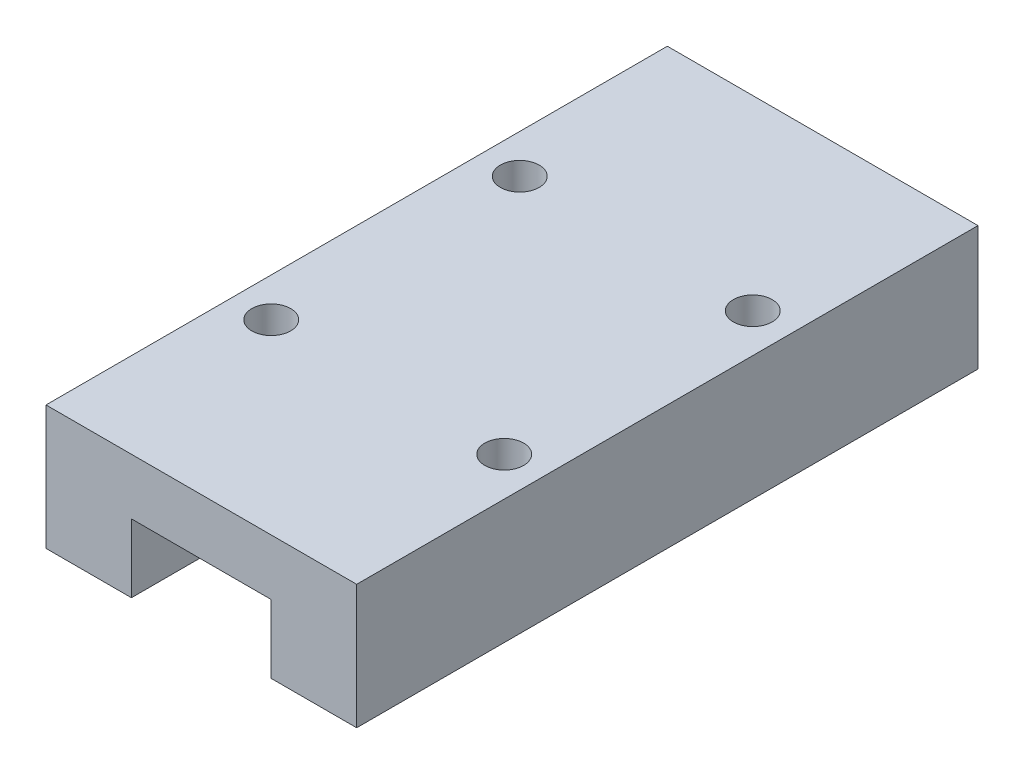
ISO-10303-21;
HEADER;
FILE_DESCRIPTION(('STEP AP214'),'2;1');
FILE_NAME('part.step','',(''),(''),'','','');
FILE_SCHEMA(('AUTOMOTIVE_DESIGN { 1 0 10303 214 1 1 1 1 }'));
ENDSEC;
DATA;
#1=APPLICATION_CONTEXT('core data for automotive mechanical design processes');
#2=APPLICATION_PROTOCOL_DEFINITION('international standard','automotive_design',2000,#1);
#3=PRODUCT_CONTEXT('',#1,'mechanical');
#4=PRODUCT('Part','Part','',(#3));
#5=PRODUCT_RELATED_PRODUCT_CATEGORY('part','',(#4));
#6=PRODUCT_DEFINITION_FORMATION('','',#4);
#7=PRODUCT_DEFINITION_CONTEXT('part definition',#1,'design');
#8=PRODUCT_DEFINITION('design','',#6,#7);
#9=PRODUCT_DEFINITION_SHAPE('','',#8);
#10=(LENGTH_UNIT() NAMED_UNIT(*) SI_UNIT(.MILLI.,.METRE.));
#11=(NAMED_UNIT(*) PLANE_ANGLE_UNIT() SI_UNIT($,.RADIAN.));
#12=(NAMED_UNIT(*) SI_UNIT($,.STERADIAN.) SOLID_ANGLE_UNIT());
#13=UNCERTAINTY_MEASURE_WITH_UNIT(LENGTH_MEASURE(1.E-05),#10,'distance_accuracy_value','');
#14=(GEOMETRIC_REPRESENTATION_CONTEXT(3) GLOBAL_UNCERTAINTY_ASSIGNED_CONTEXT((#13)) GLOBAL_UNIT_ASSIGNED_CONTEXT((#10,
#11,#12)) REPRESENTATION_CONTEXT('',''));
#15=CARTESIAN_POINT('',(0.,0.,0.));
#16=DIRECTION('',(0.,0.,1.));
#17=DIRECTION('',(1.,0.,0.));
#18=AXIS2_PLACEMENT_3D('',#15,#16,#17);
#19=CARTESIAN_POINT('',(0.,0.,40.));
#20=DIRECTION('',(1.,0.,0.));
#21=DIRECTION('',(0.,0.,-1.));
#22=AXIS2_PLACEMENT_3D('',#19,#20,#21);
#23=PLANE('',#22);
#24=DIRECTION('',(0.,-1.,0.));
#25=VECTOR('',#24,1.);
#26=CARTESIAN_POINT('',(0.,0.,0.));
#27=LINE('',#26,#25);
#28=CARTESIAN_POINT('',(0.,8.,0.));
#29=VERTEX_POINT('',#28);
#30=CARTESIAN_POINT('',(0.,0.,0.));
#31=VERTEX_POINT('',#30);
#32=EDGE_CURVE('E129',#29,#31,#27,.T.);
#33=ORIENTED_EDGE('',*,*,#32,.T.);
#34=DIRECTION('',(0.,0.,-1.));
#35=VECTOR('',#34,1.);
#36=CARTESIAN_POINT('',(0.,0.,40.));
#37=LINE('',#36,#35);
#38=CARTESIAN_POINT('',(0.,0.,40.));
#39=VERTEX_POINT('',#38);
#40=EDGE_CURVE('E11',#39,#31,#37,.T.);
#41=ORIENTED_EDGE('',*,*,#40,.F.);
#42=DIRECTION('',(0.,-1.,0.));
#43=VECTOR('',#42,1.);
#44=CARTESIAN_POINT('',(0.,0.,40.));
#45=LINE('',#44,#43);
#46=CARTESIAN_POINT('',(0.,8.,40.));
#47=VERTEX_POINT('',#46);
#48=EDGE_CURVE('E144',#47,#39,#45,.T.);
#49=ORIENTED_EDGE('',*,*,#48,.F.);
#50=DIRECTION('',(0.,0.,-1.));
#51=VECTOR('',#50,1.);
#52=CARTESIAN_POINT('',(0.,8.,40.));
#53=LINE('',#52,#51);
#54=EDGE_CURVE('E125',#47,#29,#53,.T.);
#55=ORIENTED_EDGE('',*,*,#54,.T.);
#56=EDGE_LOOP('',(#33,#41,#49,#55));
#57=FACE_BOUND('',#56,.T.);
#58=ADVANCED_FACE('F33',(#57),#23,.F.);
#59=CARTESIAN_POINT('',(0.,0.,40.));
#60=DIRECTION('',(0.,1.,0.));
#61=DIRECTION('',(0.,0.,1.));
#62=AXIS2_PLACEMENT_3D('',#59,#60,#61);
#63=PLANE('',#62);
#64=DIRECTION('',(1.,0.,0.));
#65=VECTOR('',#64,1.);
#66=CARTESIAN_POINT('',(0.,0.,0.));
#67=LINE('',#66,#65);
#68=CARTESIAN_POINT('',(5.5,0.,0.));
#69=VERTEX_POINT('',#68);
#70=EDGE_CURVE('E132',#31,#69,#67,.T.);
#71=ORIENTED_EDGE('',*,*,#70,.T.);
#72=DIRECTION('',(0.,0.,-1.));
#73=VECTOR('',#72,1.);
#74=CARTESIAN_POINT('',(5.5,0.,40.));
#75=LINE('',#74,#73);
#76=CARTESIAN_POINT('',(5.5,0.,40.));
#77=VERTEX_POINT('',#76);
#78=EDGE_CURVE('E41',#77,#69,#75,.T.);
#79=ORIENTED_EDGE('',*,*,#78,.F.);
#80=DIRECTION('',(1.,0.,0.));
#81=VECTOR('',#80,1.);
#82=CARTESIAN_POINT('',(0.,0.,40.));
#83=LINE('',#82,#81);
#84=EDGE_CURVE('E92',#39,#77,#83,.T.);
#85=ORIENTED_EDGE('',*,*,#84,.F.);
#86=ORIENTED_EDGE('',*,*,#40,.T.);
#87=EDGE_LOOP('',(#71,#79,#85,#86));
#88=FACE_BOUND('',#87,.T.);
#89=ADVANCED_FACE('F231',(#88),#63,.F.);
#90=CARTESIAN_POINT('',(5.5,0.,40.));
#91=DIRECTION('',(-1.,0.,0.));
#92=DIRECTION('',(0.,0.,1.));
#93=AXIS2_PLACEMENT_3D('',#90,#91,#92);
#94=PLANE('',#93);
#95=DIRECTION('',(0.,1.,0.));
#96=VECTOR('',#95,1.);
#97=CARTESIAN_POINT('',(5.5,0.,0.));
#98=LINE('',#97,#96);
#99=CARTESIAN_POINT('',(5.5,4.4,0.));
#100=VERTEX_POINT('',#99);
#101=EDGE_CURVE('E135',#69,#100,#98,.T.);
#102=ORIENTED_EDGE('',*,*,#101,.T.);
#103=DIRECTION('',(0.,0.,-1.));
#104=VECTOR('',#103,1.);
#105=CARTESIAN_POINT('',(5.5,4.4,40.));
#106=LINE('',#105,#104);
#107=CARTESIAN_POINT('',(5.5,4.4,40.));
#108=VERTEX_POINT('',#107);
#109=EDGE_CURVE('E151',#108,#100,#106,.T.);
#110=ORIENTED_EDGE('',*,*,#109,.F.);
#111=DIRECTION('',(0.,1.,0.));
#112=VECTOR('',#111,1.);
#113=CARTESIAN_POINT('',(5.5,0.,40.));
#114=LINE('',#113,#112);
#115=EDGE_CURVE('E159',#77,#108,#114,.T.);
#116=ORIENTED_EDGE('',*,*,#115,.F.);
#117=ORIENTED_EDGE('',*,*,#78,.T.);
#118=EDGE_LOOP('',(#102,#110,#116,#117));
#119=FACE_BOUND('',#118,.T.);
#120=ADVANCED_FACE('F157',(#119),#94,.F.);
#121=CARTESIAN_POINT('',(5.5,4.4,40.));
#122=DIRECTION('',(0.,1.,0.));
#123=DIRECTION('',(0.,0.,1.));
#124=AXIS2_PLACEMENT_3D('',#121,#122,#123);
#125=PLANE('',#124);
#126=DIRECTION('',(1.,0.,0.));
#127=VECTOR('',#126,1.);
#128=CARTESIAN_POINT('',(5.5,4.4,0.));
#129=LINE('',#128,#127);
#130=CARTESIAN_POINT('',(14.5,4.4,0.));
#131=VERTEX_POINT('',#130);
#132=EDGE_CURVE('E137',#100,#131,#129,.T.);
#133=ORIENTED_EDGE('',*,*,#132,.T.);
#134=DIRECTION('',(0.,0.,-1.));
#135=VECTOR('',#134,1.);
#136=CARTESIAN_POINT('',(14.5,4.4,40.));
#137=LINE('',#136,#135);
#138=CARTESIAN_POINT('',(14.5,4.4,40.));
#139=VERTEX_POINT('',#138);
#140=EDGE_CURVE('E148',#139,#131,#137,.T.);
#141=ORIENTED_EDGE('',*,*,#140,.F.);
#142=DIRECTION('',(1.,0.,0.));
#143=VECTOR('',#142,1.);
#144=CARTESIAN_POINT('',(5.5,4.4,40.));
#145=LINE('',#144,#143);
#146=EDGE_CURVE('E171',#108,#139,#145,.T.);
#147=ORIENTED_EDGE('',*,*,#146,.F.);
#148=ORIENTED_EDGE('',*,*,#109,.T.);
#149=EDGE_LOOP('',(#133,#141,#147,#148));
#150=FACE_BOUND('',#149,.T.);
#151=ADVANCED_FACE('F167',(#150),#125,.F.);
#152=CARTESIAN_POINT('',(14.5,4.4,40.));
#153=DIRECTION('',(1.,0.,0.));
#154=DIRECTION('',(0.,0.,-1.));
#155=AXIS2_PLACEMENT_3D('',#152,#153,#154);
#156=PLANE('',#155);
#157=DIRECTION('',(0.,-1.,0.));
#158=VECTOR('',#157,1.);
#159=CARTESIAN_POINT('',(14.5,4.4,0.));
#160=LINE('',#159,#158);
#161=CARTESIAN_POINT('',(14.5,0.,0.));
#162=VERTEX_POINT('',#161);
#163=EDGE_CURVE('E139',#131,#162,#160,.T.);
#164=ORIENTED_EDGE('',*,*,#163,.T.);
#165=DIRECTION('',(0.,0.,-1.));
#166=VECTOR('',#165,1.);
#167=CARTESIAN_POINT('',(14.5,0.,40.));
#168=LINE('',#167,#166);
#169=CARTESIAN_POINT('',(14.5,0.,40.));
#170=VERTEX_POINT('',#169);
#171=EDGE_CURVE('E120',#170,#162,#168,.T.);
#172=ORIENTED_EDGE('',*,*,#171,.F.);
#173=DIRECTION('',(0.,-1.,0.));
#174=VECTOR('',#173,1.);
#175=CARTESIAN_POINT('',(14.5,4.4,40.));
#176=LINE('',#175,#174);
#177=EDGE_CURVE('E111',#139,#170,#176,.T.);
#178=ORIENTED_EDGE('',*,*,#177,.F.);
#179=ORIENTED_EDGE('',*,*,#140,.T.);
#180=EDGE_LOOP('',(#164,#172,#178,#179));
#181=FACE_BOUND('',#180,.T.);
#182=ADVANCED_FACE('F170',(#181),#156,.F.);
#183=CARTESIAN_POINT('',(14.5,0.,40.));
#184=DIRECTION('',(0.,1.,0.));
#185=DIRECTION('',(0.,0.,1.));
#186=AXIS2_PLACEMENT_3D('',#183,#184,#185);
#187=PLANE('',#186);
#188=DIRECTION('',(1.,0.,0.));
#189=VECTOR('',#188,1.);
#190=CARTESIAN_POINT('',(14.5,0.,0.));
#191=LINE('',#190,#189);
#192=CARTESIAN_POINT('',(20.,0.,0.));
#193=VERTEX_POINT('',#192);
#194=EDGE_CURVE('E119',#162,#193,#191,.T.);
#195=ORIENTED_EDGE('',*,*,#194,.T.);
#196=DIRECTION('',(0.,0.,-1.));
#197=VECTOR('',#196,1.);
#198=CARTESIAN_POINT('',(20.,0.,40.));
#199=LINE('',#198,#197);
#200=CARTESIAN_POINT('',(20.,0.,40.));
#201=VERTEX_POINT('',#200);
#202=EDGE_CURVE('E116',#201,#193,#199,.T.);
#203=ORIENTED_EDGE('',*,*,#202,.F.);
#204=DIRECTION('',(1.,0.,0.));
#205=VECTOR('',#204,1.);
#206=CARTESIAN_POINT('',(14.5,0.,40.));
#207=LINE('',#206,#205);
#208=EDGE_CURVE('E105',#170,#201,#207,.T.);
#209=ORIENTED_EDGE('',*,*,#208,.F.);
#210=ORIENTED_EDGE('',*,*,#171,.T.);
#211=EDGE_LOOP('',(#195,#203,#209,#210));
#212=FACE_BOUND('',#211,.T.);
#213=ADVANCED_FACE('F117',(#212),#187,.F.);
#214=CARTESIAN_POINT('',(20.,0.,40.));
#215=DIRECTION('',(-1.,0.,0.));
#216=DIRECTION('',(0.,0.,1.));
#217=AXIS2_PLACEMENT_3D('',#214,#215,#216);
#218=PLANE('',#217);
#219=DIRECTION('',(0.,1.,0.));
#220=VECTOR('',#219,1.);
#221=CARTESIAN_POINT('',(20.,0.,0.));
#222=LINE('',#221,#220);
#223=CARTESIAN_POINT('',(20.,8.,0.));
#224=VERTEX_POINT('',#223);
#225=EDGE_CURVE('E78',#193,#224,#222,.T.);
#226=ORIENTED_EDGE('',*,*,#225,.T.);
#227=DIRECTION('',(0.,0.,-1.));
#228=VECTOR('',#227,1.);
#229=CARTESIAN_POINT('',(20.,8.,40.));
#230=LINE('',#229,#228);
#231=CARTESIAN_POINT('',(20.,8.,40.));
#232=VERTEX_POINT('',#231);
#233=EDGE_CURVE('E121',#232,#224,#230,.T.);
#234=ORIENTED_EDGE('',*,*,#233,.F.);
#235=DIRECTION('',(0.,1.,0.));
#236=VECTOR('',#235,1.);
#237=CARTESIAN_POINT('',(20.,0.,40.));
#238=LINE('',#237,#236);
#239=EDGE_CURVE('E109',#201,#232,#238,.T.);
#240=ORIENTED_EDGE('',*,*,#239,.F.);
#241=ORIENTED_EDGE('',*,*,#202,.T.);
#242=EDGE_LOOP('',(#226,#234,#240,#241));
#243=FACE_BOUND('',#242,.T.);
#244=ADVANCED_FACE('F123',(#243),#218,.F.);
#245=CARTESIAN_POINT('',(0.,8.,40.));
#246=DIRECTION('',(0.,-1.,0.));
#247=DIRECTION('',(0.,0.,-1.));
#248=AXIS2_PLACEMENT_3D('',#245,#246,#247);
#249=PLANE('',#248);
#250=CARTESIAN_POINT('',(2.5,8.,28.));
#251=DIRECTION('',(0.,1.,0.));
#252=DIRECTION('',(0.,0.,-1.));
#253=AXIS2_PLACEMENT_3D('',#250,#251,#252);
#254=CIRCLE('',#253,1.25);
#255=CARTESIAN_POINT('',(2.5,8.,26.75));
#256=VERTEX_POINT('',#255);
#257=EDGE_CURVE('E183',#256,#256,#254,.T.);
#258=ORIENTED_EDGE('',*,*,#257,.F.);
#259=EDGE_LOOP('',(#258));
#260=FACE_BOUND('',#259,.T.);
#261=CARTESIAN_POINT('',(17.5,8.,28.));
#262=DIRECTION('',(0.,1.,0.));
#263=DIRECTION('',(0.,0.,1.));
#264=AXIS2_PLACEMENT_3D('',#261,#262,#263);
#265=CIRCLE('',#264,1.25);
#266=CARTESIAN_POINT('',(17.5,8.,29.25));
#267=VERTEX_POINT('',#266);
#268=EDGE_CURVE('E189',#267,#267,#265,.T.);
#269=ORIENTED_EDGE('',*,*,#268,.F.);
#270=EDGE_LOOP('',(#269));
#271=FACE_BOUND('',#270,.T.);
#272=CARTESIAN_POINT('',(17.5,8.,12.));
#273=DIRECTION('',(0.,1.,0.));
#274=DIRECTION('',(0.,0.,-1.));
#275=AXIS2_PLACEMENT_3D('',#272,#273,#274);
#276=CIRCLE('',#275,1.25);
#277=CARTESIAN_POINT('',(17.5,8.,10.75));
#278=VERTEX_POINT('',#277);
#279=EDGE_CURVE('E195',#278,#278,#276,.T.);
#280=ORIENTED_EDGE('',*,*,#279,.F.);
#281=EDGE_LOOP('',(#280));
#282=FACE_BOUND('',#281,.T.);
#283=CARTESIAN_POINT('',(2.5,8.,12.));
#284=DIRECTION('',(0.,1.,0.));
#285=DIRECTION('',(0.,0.,1.));
#286=AXIS2_PLACEMENT_3D('',#283,#284,#285);
#287=CIRCLE('',#286,1.25);
#288=CARTESIAN_POINT('',(2.5,8.,13.25));
#289=VERTEX_POINT('',#288);
#290=EDGE_CURVE('E177',#289,#289,#287,.T.);
#291=ORIENTED_EDGE('',*,*,#290,.F.);
#292=EDGE_LOOP('',(#291));
#293=FACE_BOUND('',#292,.T.);
#294=DIRECTION('',(-1.,0.,0.));
#295=VECTOR('',#294,1.);
#296=CARTESIAN_POINT('',(0.,8.,0.));
#297=LINE('',#296,#295);
#298=EDGE_CURVE('E84',#224,#29,#297,.T.);
#299=ORIENTED_EDGE('',*,*,#298,.T.);
#300=ORIENTED_EDGE('',*,*,#54,.F.);
#301=DIRECTION('',(-1.,0.,0.));
#302=VECTOR('',#301,1.);
#303=CARTESIAN_POINT('',(0.,8.,40.));
#304=LINE('',#303,#302);
#305=EDGE_CURVE('E49',#232,#47,#304,.T.);
#306=ORIENTED_EDGE('',*,*,#305,.F.);
#307=ORIENTED_EDGE('',*,*,#233,.T.);
#308=EDGE_LOOP('',(#299,#300,#306,#307));
#309=FACE_BOUND('',#308,.T.);
#310=ADVANCED_FACE('F210',(#260,#271,#282,#293,#309),#249,.F.);
#311=CARTESIAN_POINT('',(0.,0.,40.));
#312=DIRECTION('',(0.,0.,-1.));
#313=DIRECTION('',(-1.,0.,0.));
#314=AXIS2_PLACEMENT_3D('',#311,#312,#313);
#315=PLANE('',#314);
#316=ORIENTED_EDGE('',*,*,#48,.T.);
#317=ORIENTED_EDGE('',*,*,#84,.T.);
#318=ORIENTED_EDGE('',*,*,#115,.T.);
#319=ORIENTED_EDGE('',*,*,#146,.T.);
#320=ORIENTED_EDGE('',*,*,#177,.T.);
#321=ORIENTED_EDGE('',*,*,#208,.T.);
#322=ORIENTED_EDGE('',*,*,#239,.T.);
#323=ORIENTED_EDGE('',*,*,#305,.T.);
#324=EDGE_LOOP('',(#316,#317,#318,#319,#320,#321,#322,#323));
#325=FACE_BOUND('',#324,.T.);
#326=ADVANCED_FACE('F107',(#325),#315,.F.);
#327=CARTESIAN_POINT('',(0.,0.,0.));
#328=DIRECTION('',(0.,0.,-1.));
#329=DIRECTION('',(-1.,0.,0.));
#330=AXIS2_PLACEMENT_3D('',#327,#328,#329);
#331=PLANE('',#330);
#332=ORIENTED_EDGE('',*,*,#32,.F.);
#333=ORIENTED_EDGE('',*,*,#298,.F.);
#334=ORIENTED_EDGE('',*,*,#225,.F.);
#335=ORIENTED_EDGE('',*,*,#194,.F.);
#336=ORIENTED_EDGE('',*,*,#163,.F.);
#337=ORIENTED_EDGE('',*,*,#132,.F.);
#338=ORIENTED_EDGE('',*,*,#101,.F.);
#339=ORIENTED_EDGE('',*,*,#70,.F.);
#340=EDGE_LOOP('',(#332,#333,#334,#335,#336,#337,#338,#339));
#341=FACE_BOUND('',#340,.T.);
#342=ADVANCED_FACE('F163',(#341),#331,.T.);
#343=CARTESIAN_POINT('',(2.5,3.,12.));
#344=DIRECTION('',(0.,1.,0.));
#345=DIRECTION('',(0.,0.,1.));
#346=AXIS2_PLACEMENT_3D('',#343,#344,#345);
#347=CYLINDRICAL_SURFACE('',#346,1.25);
#348=CARTESIAN_POINT('',(2.5,3.,12.));
#349=DIRECTION('',(0.,1.,0.));
#350=DIRECTION('',(0.,0.,1.));
#351=AXIS2_PLACEMENT_3D('',#348,#349,#350);
#352=CIRCLE('',#351,1.25);
#353=CARTESIAN_POINT('',(2.5,3.,13.25));
#354=VERTEX_POINT('',#353);
#355=EDGE_CURVE('E133',#354,#354,#352,.T.);
#356=ORIENTED_EDGE('',*,*,#355,.F.);
#357=EDGE_LOOP('',(#356));
#358=FACE_BOUND('',#357,.T.);
#359=ORIENTED_EDGE('',*,*,#290,.T.);
#360=EDGE_LOOP('',(#359));
#361=FACE_BOUND('',#360,.T.);
#362=ADVANCED_FACE('F217',(#358,#361),#347,.F.);
#363=CARTESIAN_POINT('',(2.5,3.,12.));
#364=DIRECTION('',(0.,1.,0.));
#365=DIRECTION('',(0.,0.,1.));
#366=AXIS2_PLACEMENT_3D('',#363,#364,#365);
#367=PLANE('',#366);
#368=ORIENTED_EDGE('',*,*,#355,.T.);
#369=EDGE_LOOP('',(#368));
#370=FACE_BOUND('',#369,.T.);
#371=ADVANCED_FACE('F206',(#370),#367,.T.);
#372=CARTESIAN_POINT('',(17.5,3.,12.));
#373=DIRECTION('',(0.,1.,0.));
#374=DIRECTION('',(0.,0.,1.));
#375=AXIS2_PLACEMENT_3D('',#372,#373,#374);
#376=CYLINDRICAL_SURFACE('',#375,1.25);
#377=CARTESIAN_POINT('',(17.5,3.,12.));
#378=DIRECTION('',(0.,1.,0.));
#379=DIRECTION('',(0.,0.,-1.));
#380=AXIS2_PLACEMENT_3D('',#377,#378,#379);
#381=CIRCLE('',#380,1.25);
#382=CARTESIAN_POINT('',(17.5,3.,10.75));
#383=VERTEX_POINT('',#382);
#384=EDGE_CURVE('E180',#383,#383,#381,.T.);
#385=ORIENTED_EDGE('',*,*,#384,.F.);
#386=EDGE_LOOP('',(#385));
#387=FACE_BOUND('',#386,.T.);
#388=ORIENTED_EDGE('',*,*,#279,.T.);
#389=EDGE_LOOP('',(#388));
#390=FACE_BOUND('',#389,.T.);
#391=ADVANCED_FACE('F203',(#387,#390),#376,.F.);
#392=CARTESIAN_POINT('',(17.5,3.,12.));
#393=DIRECTION('',(0.,-1.,0.));
#394=DIRECTION('',(0.,0.,-1.));
#395=AXIS2_PLACEMENT_3D('',#392,#393,#394);
#396=PLANE('',#395);
#397=ORIENTED_EDGE('',*,*,#384,.T.);
#398=EDGE_LOOP('',(#397));
#399=FACE_BOUND('',#398,.T.);
#400=ADVANCED_FACE('F201',(#399),#396,.F.);
#401=CARTESIAN_POINT('',(17.5,3.,28.));
#402=DIRECTION('',(0.,1.,0.));
#403=DIRECTION('',(0.,0.,1.));
#404=AXIS2_PLACEMENT_3D('',#401,#402,#403);
#405=CYLINDRICAL_SURFACE('',#404,1.25);
#406=CARTESIAN_POINT('',(17.5,3.,28.));
#407=DIRECTION('',(0.,1.,0.));
#408=DIRECTION('',(0.,0.,1.));
#409=AXIS2_PLACEMENT_3D('',#406,#407,#408);
#410=CIRCLE('',#409,1.25);
#411=CARTESIAN_POINT('',(17.5,3.,29.25));
#412=VERTEX_POINT('',#411);
#413=EDGE_CURVE('E192',#412,#412,#410,.T.);
#414=ORIENTED_EDGE('',*,*,#413,.F.);
#415=EDGE_LOOP('',(#414));
#416=FACE_BOUND('',#415,.T.);
#417=ORIENTED_EDGE('',*,*,#268,.T.);
#418=EDGE_LOOP('',(#417));
#419=FACE_BOUND('',#418,.T.);
#420=ADVANCED_FACE('F290',(#416,#419),#405,.F.);
#421=CARTESIAN_POINT('',(17.5,3.,28.));
#422=DIRECTION('',(0.,1.,0.));
#423=DIRECTION('',(0.,0.,1.));
#424=AXIS2_PLACEMENT_3D('',#421,#422,#423);
#425=PLANE('',#424);
#426=ORIENTED_EDGE('',*,*,#413,.T.);
#427=EDGE_LOOP('',(#426));
#428=FACE_BOUND('',#427,.T.);
#429=ADVANCED_FACE('F299',(#428),#425,.T.);
#430=CARTESIAN_POINT('',(2.5,3.,28.));
#431=DIRECTION('',(0.,1.,0.));
#432=DIRECTION('',(0.,0.,1.));
#433=AXIS2_PLACEMENT_3D('',#430,#431,#432);
#434=CYLINDRICAL_SURFACE('',#433,1.25);
#435=CARTESIAN_POINT('',(2.5,3.,28.));
#436=DIRECTION('',(0.,1.,0.));
#437=DIRECTION('',(0.,0.,-1.));
#438=AXIS2_PLACEMENT_3D('',#435,#436,#437);
#439=CIRCLE('',#438,1.25);
#440=CARTESIAN_POINT('',(2.5,3.,26.75));
#441=VERTEX_POINT('',#440);
#442=EDGE_CURVE('E186',#441,#441,#439,.T.);
#443=ORIENTED_EDGE('',*,*,#442,.F.);
#444=EDGE_LOOP('',(#443));
#445=FACE_BOUND('',#444,.T.);
#446=ORIENTED_EDGE('',*,*,#257,.T.);
#447=EDGE_LOOP('',(#446));
#448=FACE_BOUND('',#447,.T.);
#449=ADVANCED_FACE('F309',(#445,#448),#434,.F.);
#450=CARTESIAN_POINT('',(2.5,3.,28.));
#451=DIRECTION('',(0.,-1.,0.));
#452=DIRECTION('',(0.,0.,-1.));
#453=AXIS2_PLACEMENT_3D('',#450,#451,#452);
#454=PLANE('',#453);
#455=ORIENTED_EDGE('',*,*,#442,.T.);
#456=EDGE_LOOP('',(#455));
#457=FACE_BOUND('',#456,.T.);
#458=ADVANCED_FACE('F319',(#457),#454,.F.);
#459=CLOSED_SHELL('',(#58,#89,#120,#151,#182,#213,#244,#310,#326,#342,#362,#371,#391,#400,#420,
#429,#449,#458));
#460=MANIFOLD_SOLID_BREP('B2',#459);
#461=ADVANCED_BREP_SHAPE_REPRESENTATION('',(#18,#460),#14);
#462=SHAPE_DEFINITION_REPRESENTATION(#9,#461);
ENDSEC;
END-ISO-10303-21;
